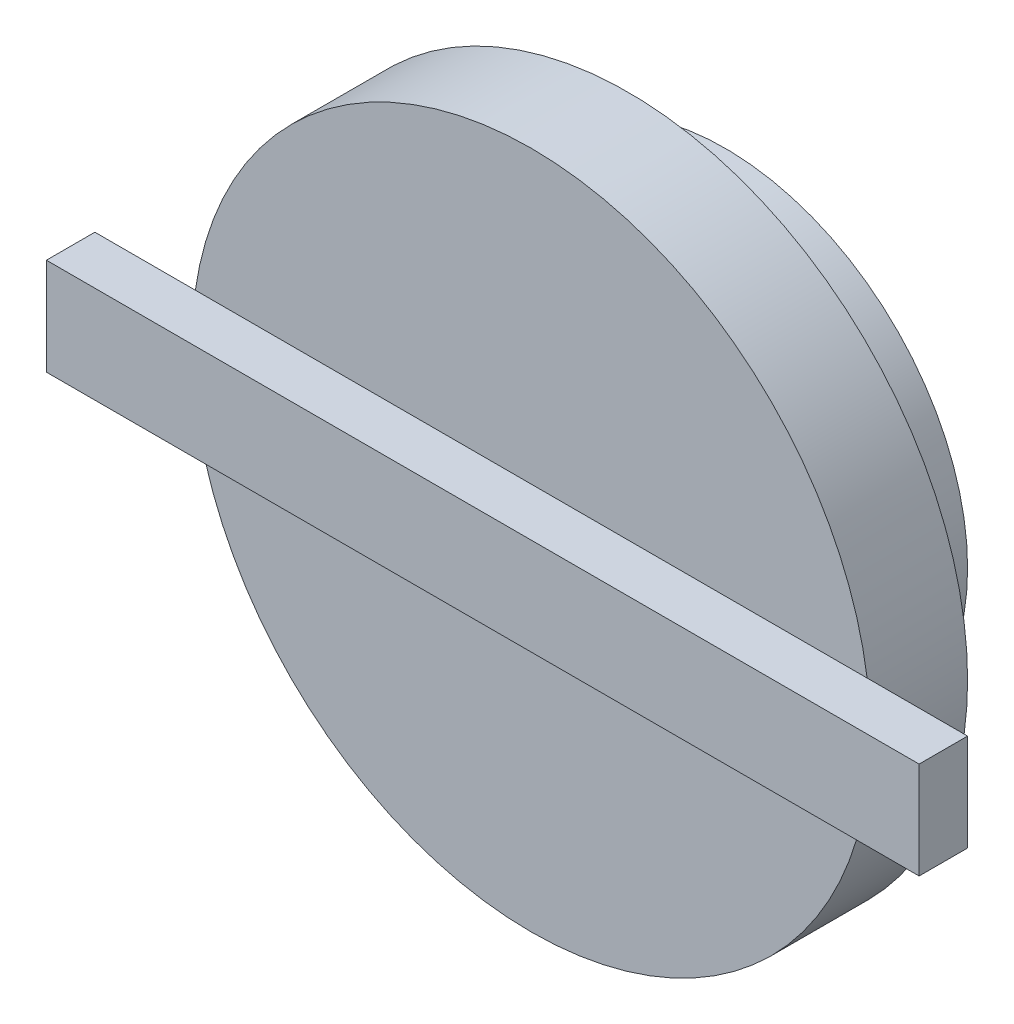
ISO-10303-21;
HEADER;
FILE_DESCRIPTION(('STEP AP214'),'2;1');
FILE_NAME('part.step','',(''),(''),'','','');
FILE_SCHEMA(('AUTOMOTIVE_DESIGN { 1 0 10303 214 1 1 1 1 }'));
ENDSEC;
DATA;
#1=APPLICATION_CONTEXT('core data for automotive mechanical design processes');
#2=APPLICATION_PROTOCOL_DEFINITION('international standard','automotive_design',2000,#1);
#3=PRODUCT_CONTEXT('',#1,'mechanical');
#4=PRODUCT('Part','Part','',(#3));
#5=PRODUCT_RELATED_PRODUCT_CATEGORY('part','',(#4));
#6=PRODUCT_DEFINITION_FORMATION('','',#4);
#7=PRODUCT_DEFINITION_CONTEXT('part definition',#1,'design');
#8=PRODUCT_DEFINITION('design','',#6,#7);
#9=PRODUCT_DEFINITION_SHAPE('','',#8);
#10=(LENGTH_UNIT() NAMED_UNIT(*) SI_UNIT(.MILLI.,.METRE.));
#11=(NAMED_UNIT(*) PLANE_ANGLE_UNIT() SI_UNIT($,.RADIAN.));
#12=(NAMED_UNIT(*) SI_UNIT($,.STERADIAN.) SOLID_ANGLE_UNIT());
#13=UNCERTAINTY_MEASURE_WITH_UNIT(LENGTH_MEASURE(1.E-05),#10,'distance_accuracy_value','');
#14=(GEOMETRIC_REPRESENTATION_CONTEXT(3) GLOBAL_UNCERTAINTY_ASSIGNED_CONTEXT((#13)) GLOBAL_UNIT_ASSIGNED_CONTEXT((#10,
#11,#12)) REPRESENTATION_CONTEXT('',''));
#15=CARTESIAN_POINT('',(0.,0.,0.));
#16=DIRECTION('',(0.,0.,1.));
#17=DIRECTION('',(1.,0.,0.));
#18=AXIS2_PLACEMENT_3D('',#15,#16,#17);
#19=CARTESIAN_POINT('',(0.,0.,20.));
#20=DIRECTION('',(0.,0.,1.));
#21=DIRECTION('',(1.,0.,0.));
#22=AXIS2_PLACEMENT_3D('',#19,#20,#21);
#23=PLANE('',#22);
#24=DIRECTION('',(1.,0.,0.));
#25=VECTOR('',#24,1.);
#26=CARTESIAN_POINT('',(-45.,-5.,20.));
#27=LINE('',#26,#25);
#28=CARTESIAN_POINT('',(-34.6410161513775,-5.,20.));
#29=VERTEX_POINT('',#28);
#30=CARTESIAN_POINT('',(34.6410161513775,-5.,20.));
#31=VERTEX_POINT('',#30);
#32=EDGE_CURVE('E11',#29,#31,#27,.T.);
#33=ORIENTED_EDGE('',*,*,#32,.F.);
#34=CARTESIAN_POINT('',(0.,0.,20.));
#35=DIRECTION('',(0.,0.,1.));
#36=DIRECTION('',(1.,0.,0.));
#37=AXIS2_PLACEMENT_3D('',#34,#35,#36);
#38=CIRCLE('',#37,35.);
#39=EDGE_CURVE('E175',#29,#31,#38,.T.);
#40=ORIENTED_EDGE('',*,*,#39,.T.);
#41=EDGE_LOOP('',(#33,#40));
#42=FACE_BOUND('',#41,.T.);
#43=ADVANCED_FACE('F41',(#42),#23,.T.);
#44=CARTESIAN_POINT('',(0.,0.,10.));
#45=DIRECTION('',(0.,0.,-1.));
#46=DIRECTION('',(-1.,0.,0.));
#47=AXIS2_PLACEMENT_3D('',#44,#45,#46);
#48=CYLINDRICAL_SURFACE('',#47,25.);
#49=CARTESIAN_POINT('',(0.,0.,10.));
#50=DIRECTION('',(0.,0.,1.));
#51=DIRECTION('',(1.,0.,0.));
#52=AXIS2_PLACEMENT_3D('',#49,#50,#51);
#53=CIRCLE('',#52,25.);
#54=CARTESIAN_POINT('',(25.,0.,10.));
#55=VERTEX_POINT('',#54);
#56=EDGE_CURVE('E132',#55,#55,#53,.T.);
#57=ORIENTED_EDGE('',*,*,#56,.F.);
#58=EDGE_LOOP('',(#57));
#59=FACE_BOUND('',#58,.T.);
#60=CARTESIAN_POINT('',(0.,0.,0.));
#61=DIRECTION('',(0.,0.,1.));
#62=DIRECTION('',(1.,0.,0.));
#63=AXIS2_PLACEMENT_3D('',#60,#61,#62);
#64=CIRCLE('',#63,25.);
#65=CARTESIAN_POINT('',(25.,0.,0.));
#66=VERTEX_POINT('',#65);
#67=EDGE_CURVE('E45',#66,#66,#64,.T.);
#68=ORIENTED_EDGE('',*,*,#67,.T.);
#69=EDGE_LOOP('',(#68));
#70=FACE_BOUND('',#69,.T.);
#71=ADVANCED_FACE('F43',(#59,#70),#48,.T.);
#72=CARTESIAN_POINT('',(0.,0.,0.));
#73=DIRECTION('',(0.,0.,1.));
#74=DIRECTION('',(1.,0.,0.));
#75=AXIS2_PLACEMENT_3D('',#72,#73,#74);
#76=PLANE('',#75);
#77=ORIENTED_EDGE('',*,*,#67,.F.);
#78=EDGE_LOOP('',(#77));
#79=FACE_BOUND('',#78,.T.);
#80=ADVANCED_FACE('F144',(#79),#76,.F.);
#81=CARTESIAN_POINT('',(0.,0.,20.));
#82=DIRECTION('',(0.,0.,-1.));
#83=DIRECTION('',(-1.,0.,0.));
#84=AXIS2_PLACEMENT_3D('',#81,#82,#83);
#85=CYLINDRICAL_SURFACE('',#84,35.);
#86=CARTESIAN_POINT('',(34.6410161513775,5.,20.));
#87=VERTEX_POINT('',#86);
#88=CARTESIAN_POINT('',(-34.6410161513775,5.,20.));
#89=VERTEX_POINT('',#88);
#90=EDGE_CURVE('E130',#87,#89,#38,.T.);
#91=ORIENTED_EDGE('',*,*,#90,.F.);
#92=EDGE_CURVE('E60',#31,#87,#38,.T.);
#93=ORIENTED_EDGE('',*,*,#92,.F.);
#94=ORIENTED_EDGE('',*,*,#39,.F.);
#95=EDGE_CURVE('E131',#89,#29,#38,.T.);
#96=ORIENTED_EDGE('',*,*,#95,.F.);
#97=EDGE_LOOP('',(#91,#93,#94,#96));
#98=FACE_BOUND('',#97,.T.);
#99=CARTESIAN_POINT('',(0.,0.,10.));
#100=DIRECTION('',(0.,0.,1.));
#101=DIRECTION('',(1.,0.,0.));
#102=AXIS2_PLACEMENT_3D('',#99,#100,#101);
#103=CIRCLE('',#102,35.);
#104=CARTESIAN_POINT('',(35.,0.,10.));
#105=VERTEX_POINT('',#104);
#106=EDGE_CURVE('E122',#105,#105,#103,.T.);
#107=ORIENTED_EDGE('',*,*,#106,.T.);
#108=EDGE_LOOP('',(#107));
#109=FACE_BOUND('',#108,.T.);
#110=ADVANCED_FACE('F146',(#98,#109),#85,.T.);
#111=DIRECTION('',(-1.,0.,0.));
#112=VECTOR('',#111,1.);
#113=CARTESIAN_POINT('',(-45.,5.,20.));
#114=LINE('',#113,#112);
#115=EDGE_CURVE('E50',#87,#89,#114,.T.);
#116=ORIENTED_EDGE('',*,*,#115,.F.);
#117=ORIENTED_EDGE('',*,*,#90,.T.);
#118=EDGE_LOOP('',(#116,#117));
#119=FACE_BOUND('',#118,.T.);
#120=ADVANCED_FACE('F152',(#119),#23,.T.);
#121=CARTESIAN_POINT('',(0.,0.,10.));
#122=DIRECTION('',(0.,0.,1.));
#123=DIRECTION('',(1.,0.,0.));
#124=AXIS2_PLACEMENT_3D('',#121,#122,#123);
#125=PLANE('',#124);
#126=ORIENTED_EDGE('',*,*,#56,.T.);
#127=EDGE_LOOP('',(#126));
#128=FACE_BOUND('',#127,.T.);
#129=ORIENTED_EDGE('',*,*,#106,.F.);
#130=EDGE_LOOP('',(#129));
#131=FACE_BOUND('',#130,.T.);
#132=ADVANCED_FACE('F162',(#128,#131),#125,.F.);
#133=CARTESIAN_POINT('',(0.,0.,20.));
#134=DIRECTION('',(0.,0.,-1.));
#135=DIRECTION('',(-1.,0.,0.));
#136=AXIS2_PLACEMENT_3D('',#133,#134,#135);
#137=PLANE('',#136);
#138=CARTESIAN_POINT('',(-45.,5.,20.));
#139=VERTEX_POINT('',#138);
#140=EDGE_CURVE('E139',#89,#139,#114,.T.);
#141=ORIENTED_EDGE('',*,*,#140,.F.);
#142=ORIENTED_EDGE('',*,*,#95,.T.);
#143=CARTESIAN_POINT('',(-45.,-5.,20.));
#144=VERTEX_POINT('',#143);
#145=EDGE_CURVE('E52',#144,#29,#27,.T.);
#146=ORIENTED_EDGE('',*,*,#145,.F.);
#147=DIRECTION('',(0.,-1.,0.));
#148=VECTOR('',#147,1.);
#149=CARTESIAN_POINT('',(-45.,-5.,20.));
#150=LINE('',#149,#148);
#151=EDGE_CURVE('E176',#139,#144,#150,.T.);
#152=ORIENTED_EDGE('',*,*,#151,.F.);
#153=EDGE_LOOP('',(#141,#142,#146,#152));
#154=FACE_BOUND('',#153,.T.);
#155=ADVANCED_FACE('F167',(#154),#137,.T.);
#156=CARTESIAN_POINT('',(45.,-5.,25.));
#157=DIRECTION('',(-1.,0.,0.));
#158=DIRECTION('',(0.,0.,1.));
#159=AXIS2_PLACEMENT_3D('',#156,#157,#158);
#160=PLANE('',#159);
#161=DIRECTION('',(0.,1.,0.));
#162=VECTOR('',#161,1.);
#163=CARTESIAN_POINT('',(45.,-5.,20.));
#164=LINE('',#163,#162);
#165=CARTESIAN_POINT('',(45.,-5.,20.));
#166=VERTEX_POINT('',#165);
#167=CARTESIAN_POINT('',(45.,5.,20.));
#168=VERTEX_POINT('',#167);
#169=EDGE_CURVE('E121',#166,#168,#164,.T.);
#170=ORIENTED_EDGE('',*,*,#169,.T.);
#171=DIRECTION('',(0.,0.,-1.));
#172=VECTOR('',#171,1.);
#173=CARTESIAN_POINT('',(45.,5.,25.));
#174=LINE('',#173,#172);
#175=CARTESIAN_POINT('',(45.,5.,25.));
#176=VERTEX_POINT('',#175);
#177=EDGE_CURVE('E102',#176,#168,#174,.T.);
#178=ORIENTED_EDGE('',*,*,#177,.F.);
#179=DIRECTION('',(0.,1.,0.));
#180=VECTOR('',#179,1.);
#181=CARTESIAN_POINT('',(45.,-5.,25.));
#182=LINE('',#181,#180);
#183=CARTESIAN_POINT('',(45.,-5.,25.));
#184=VERTEX_POINT('',#183);
#185=EDGE_CURVE('E109',#184,#176,#182,.T.);
#186=ORIENTED_EDGE('',*,*,#185,.F.);
#187=DIRECTION('',(0.,0.,-1.));
#188=VECTOR('',#187,1.);
#189=CARTESIAN_POINT('',(45.,-5.,25.));
#190=LINE('',#189,#188);
#191=EDGE_CURVE('E182',#184,#166,#190,.T.);
#192=ORIENTED_EDGE('',*,*,#191,.T.);
#193=EDGE_LOOP('',(#170,#178,#186,#192));
#194=FACE_BOUND('',#193,.T.);
#195=ADVANCED_FACE('F119',(#194),#160,.F.);
#196=CARTESIAN_POINT('',(-45.,5.,25.));
#197=DIRECTION('',(0.,-1.,0.));
#198=DIRECTION('',(0.,0.,-1.));
#199=AXIS2_PLACEMENT_3D('',#196,#197,#198);
#200=PLANE('',#199);
#201=EDGE_CURVE('E138',#168,#87,#114,.T.);
#202=ORIENTED_EDGE('',*,*,#201,.T.);
#203=ORIENTED_EDGE('',*,*,#115,.T.);
#204=ORIENTED_EDGE('',*,*,#140,.T.);
#205=DIRECTION('',(0.,0.,-1.));
#206=VECTOR('',#205,1.);
#207=CARTESIAN_POINT('',(-45.,5.,25.));
#208=LINE('',#207,#206);
#209=CARTESIAN_POINT('',(-45.,5.,25.));
#210=VERTEX_POINT('',#209);
#211=EDGE_CURVE('E105',#210,#139,#208,.T.);
#212=ORIENTED_EDGE('',*,*,#211,.F.);
#213=DIRECTION('',(-1.,0.,0.));
#214=VECTOR('',#213,1.);
#215=CARTESIAN_POINT('',(-45.,5.,25.));
#216=LINE('',#215,#214);
#217=EDGE_CURVE('E97',#176,#210,#216,.T.);
#218=ORIENTED_EDGE('',*,*,#217,.F.);
#219=ORIENTED_EDGE('',*,*,#177,.T.);
#220=EDGE_LOOP('',(#202,#203,#204,#212,#218,#219));
#221=FACE_BOUND('',#220,.T.);
#222=ADVANCED_FACE('F100',(#221),#200,.F.);
#223=CARTESIAN_POINT('',(-45.,-5.,25.));
#224=DIRECTION('',(1.,0.,0.));
#225=DIRECTION('',(0.,0.,-1.));
#226=AXIS2_PLACEMENT_3D('',#223,#224,#225);
#227=PLANE('',#226);
#228=ORIENTED_EDGE('',*,*,#151,.T.);
#229=DIRECTION('',(0.,0.,-1.));
#230=VECTOR('',#229,1.);
#231=CARTESIAN_POINT('',(-45.,-5.,25.));
#232=LINE('',#231,#230);
#233=CARTESIAN_POINT('',(-45.,-5.,25.));
#234=VERTEX_POINT('',#233);
#235=EDGE_CURVE('E126',#234,#144,#232,.T.);
#236=ORIENTED_EDGE('',*,*,#235,.F.);
#237=DIRECTION('',(0.,-1.,0.));
#238=VECTOR('',#237,1.);
#239=CARTESIAN_POINT('',(-45.,-5.,25.));
#240=LINE('',#239,#238);
#241=EDGE_CURVE('E108',#210,#234,#240,.T.);
#242=ORIENTED_EDGE('',*,*,#241,.F.);
#243=ORIENTED_EDGE('',*,*,#211,.T.);
#244=EDGE_LOOP('',(#228,#236,#242,#243));
#245=FACE_BOUND('',#244,.T.);
#246=ADVANCED_FACE('F191',(#245),#227,.F.);
#247=CARTESIAN_POINT('',(-45.,-5.,25.));
#248=DIRECTION('',(0.,1.,0.));
#249=DIRECTION('',(0.,0.,1.));
#250=AXIS2_PLACEMENT_3D('',#247,#248,#249);
#251=PLANE('',#250);
#252=ORIENTED_EDGE('',*,*,#145,.T.);
#253=ORIENTED_EDGE('',*,*,#32,.T.);
#254=EDGE_CURVE('E53',#31,#166,#27,.T.);
#255=ORIENTED_EDGE('',*,*,#254,.T.);
#256=ORIENTED_EDGE('',*,*,#191,.F.);
#257=DIRECTION('',(1.,0.,0.));
#258=VECTOR('',#257,1.);
#259=CARTESIAN_POINT('',(-45.,-5.,25.));
#260=LINE('',#259,#258);
#261=EDGE_CURVE('E114',#234,#184,#260,.T.);
#262=ORIENTED_EDGE('',*,*,#261,.F.);
#263=ORIENTED_EDGE('',*,*,#235,.T.);
#264=EDGE_LOOP('',(#252,#253,#255,#256,#262,#263));
#265=FACE_BOUND('',#264,.T.);
#266=ADVANCED_FACE('F187',(#265),#251,.F.);
#267=CARTESIAN_POINT('',(0.,0.,25.));
#268=DIRECTION('',(0.,0.,-1.));
#269=DIRECTION('',(-1.,0.,0.));
#270=AXIS2_PLACEMENT_3D('',#267,#268,#269);
#271=PLANE('',#270);
#272=ORIENTED_EDGE('',*,*,#185,.T.);
#273=ORIENTED_EDGE('',*,*,#217,.T.);
#274=ORIENTED_EDGE('',*,*,#241,.T.);
#275=ORIENTED_EDGE('',*,*,#261,.T.);
#276=EDGE_LOOP('',(#272,#273,#274,#275));
#277=FACE_BOUND('',#276,.T.);
#278=ADVANCED_FACE('F112',(#277),#271,.F.);
#279=ORIENTED_EDGE('',*,*,#254,.F.);
#280=ORIENTED_EDGE('',*,*,#92,.T.);
#281=ORIENTED_EDGE('',*,*,#201,.F.);
#282=ORIENTED_EDGE('',*,*,#169,.F.);
#283=EDGE_LOOP('',(#279,#280,#281,#282));
#284=FACE_BOUND('',#283,.T.);
#285=ADVANCED_FACE('F174',(#284),#137,.T.);
#286=CLOSED_SHELL('',(#43,#71,#80,#110,#120,#132,#155,#195,#222,#246,#266,#278,#285));
#287=MANIFOLD_SOLID_BREP('B2',#286);
#288=ADVANCED_BREP_SHAPE_REPRESENTATION('',(#18,#287),#14);
#289=SHAPE_DEFINITION_REPRESENTATION(#9,#288);
ENDSEC;
END-ISO-10303-21;
